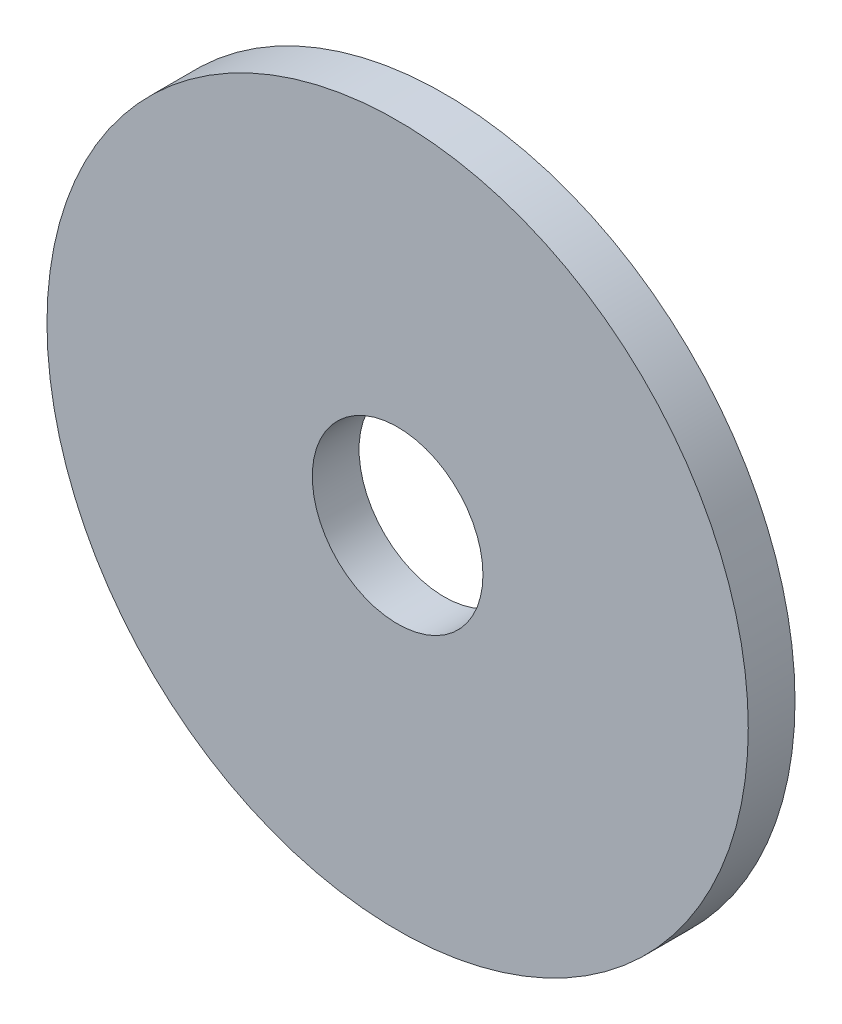
ISO-10303-21;
HEADER;
FILE_DESCRIPTION(('STEP AP214'),'2;1');
FILE_NAME('part.step','',(''),(''),'','','');
FILE_SCHEMA(('AUTOMOTIVE_DESIGN { 1 0 10303 214 1 1 1 1 }'));
ENDSEC;
DATA;
#1=APPLICATION_CONTEXT('core data for automotive mechanical design processes');
#2=APPLICATION_PROTOCOL_DEFINITION('international standard','automotive_design',2000,#1);
#3=PRODUCT_CONTEXT('',#1,'mechanical');
#4=PRODUCT('Part','Part','',(#3));
#5=PRODUCT_RELATED_PRODUCT_CATEGORY('part','',(#4));
#6=PRODUCT_DEFINITION_FORMATION('','',#4);
#7=PRODUCT_DEFINITION_CONTEXT('part definition',#1,'design');
#8=PRODUCT_DEFINITION('design','',#6,#7);
#9=PRODUCT_DEFINITION_SHAPE('','',#8);
#10=(LENGTH_UNIT() NAMED_UNIT(*) SI_UNIT(.MILLI.,.METRE.));
#11=(NAMED_UNIT(*) PLANE_ANGLE_UNIT() SI_UNIT($,.RADIAN.));
#12=(NAMED_UNIT(*) SI_UNIT($,.STERADIAN.) SOLID_ANGLE_UNIT());
#13=UNCERTAINTY_MEASURE_WITH_UNIT(LENGTH_MEASURE(1.E-05),#10,'distance_accuracy_value','');
#14=(GEOMETRIC_REPRESENTATION_CONTEXT(3) GLOBAL_UNCERTAINTY_ASSIGNED_CONTEXT((#13)) GLOBAL_UNIT_ASSIGNED_CONTEXT((#10,
#11,#12)) REPRESENTATION_CONTEXT('',''));
#15=CARTESIAN_POINT('',(0.,0.,0.));
#16=DIRECTION('',(0.,0.,1.));
#17=DIRECTION('',(1.,0.,0.));
#18=AXIS2_PLACEMENT_3D('',#15,#16,#17);
#19=CARTESIAN_POINT('',(0.,0.,1.));
#20=DIRECTION('',(0.,0.,1.));
#21=DIRECTION('',(1.,0.,0.));
#22=AXIS2_PLACEMENT_3D('',#19,#20,#21);
#23=PLANE('',#22);
#24=CARTESIAN_POINT('',(0.,0.,1.));
#25=DIRECTION('',(0.,0.,1.));
#26=DIRECTION('',(1.,0.,0.));
#27=AXIS2_PLACEMENT_3D('',#24,#25,#26);
#28=CIRCLE('',#27,15.);
#29=CARTESIAN_POINT('',(15.,0.,1.));
#30=VERTEX_POINT('',#29);
#31=EDGE_CURVE('E10',#30,#30,#28,.T.);
#32=ORIENTED_EDGE('',*,*,#31,.T.);
#33=EDGE_LOOP('',(#32));
#34=FACE_BOUND('',#33,.T.);
#35=CARTESIAN_POINT('',(0.,0.,1.));
#36=DIRECTION('',(0.,0.,1.));
#37=DIRECTION('',(1.,0.,0.));
#38=AXIS2_PLACEMENT_3D('',#35,#36,#37);
#39=CIRCLE('',#38,3.65);
#40=CARTESIAN_POINT('',(3.65,0.,1.));
#41=VERTEX_POINT('',#40);
#42=EDGE_CURVE('E46',#41,#41,#39,.T.);
#43=ORIENTED_EDGE('',*,*,#42,.F.);
#44=EDGE_LOOP('',(#43));
#45=FACE_BOUND('',#44,.T.);
#46=ADVANCED_FACE('F35',(#34,#45),#23,.T.);
#47=CARTESIAN_POINT('',(0.,0.,-1.));
#48=DIRECTION('',(0.,0.,1.));
#49=DIRECTION('',(1.,0.,0.));
#50=AXIS2_PLACEMENT_3D('',#47,#48,#49);
#51=PLANE('',#50);
#52=CARTESIAN_POINT('',(0.,0.,-1.));
#53=DIRECTION('',(0.,0.,1.));
#54=DIRECTION('',(1.,0.,0.));
#55=AXIS2_PLACEMENT_3D('',#52,#53,#54);
#56=CIRCLE('',#55,15.);
#57=CARTESIAN_POINT('',(15.,0.,-1.));
#58=VERTEX_POINT('',#57);
#59=EDGE_CURVE('E39',#58,#58,#56,.T.);
#60=ORIENTED_EDGE('',*,*,#59,.F.);
#61=EDGE_LOOP('',(#60));
#62=FACE_BOUND('',#61,.T.);
#63=CARTESIAN_POINT('',(0.,0.,-1.));
#64=DIRECTION('',(0.,0.,1.));
#65=DIRECTION('',(1.,0.,0.));
#66=AXIS2_PLACEMENT_3D('',#63,#64,#65);
#67=CIRCLE('',#66,3.65);
#68=CARTESIAN_POINT('',(3.65,0.,-1.));
#69=VERTEX_POINT('',#68);
#70=EDGE_CURVE('E48',#69,#69,#67,.T.);
#71=ORIENTED_EDGE('',*,*,#70,.T.);
#72=EDGE_LOOP('',(#71));
#73=FACE_BOUND('',#72,.T.);
#74=ADVANCED_FACE('F58',(#62,#73),#51,.F.);
#75=CARTESIAN_POINT('',(0.,0.,1.));
#76=DIRECTION('',(0.,0.,-1.));
#77=DIRECTION('',(-1.,0.,0.));
#78=AXIS2_PLACEMENT_3D('',#75,#76,#77);
#79=CYLINDRICAL_SURFACE('',#78,15.);
#80=ORIENTED_EDGE('',*,*,#31,.F.);
#81=EDGE_LOOP('',(#80));
#82=FACE_BOUND('',#81,.T.);
#83=ORIENTED_EDGE('',*,*,#59,.T.);
#84=EDGE_LOOP('',(#83));
#85=FACE_BOUND('',#84,.T.);
#86=ADVANCED_FACE('F37',(#82,#85),#79,.T.);
#87=CARTESIAN_POINT('',(0.,0.,1.));
#88=DIRECTION('',(0.,0.,-1.));
#89=DIRECTION('',(-1.,0.,0.));
#90=AXIS2_PLACEMENT_3D('',#87,#88,#89);
#91=CYLINDRICAL_SURFACE('',#90,3.65);
#92=ORIENTED_EDGE('',*,*,#42,.T.);
#93=EDGE_LOOP('',(#92));
#94=FACE_BOUND('',#93,.T.);
#95=ORIENTED_EDGE('',*,*,#70,.F.);
#96=EDGE_LOOP('',(#95));
#97=FACE_BOUND('',#96,.T.);
#98=ADVANCED_FACE('F54',(#94,#97),#91,.F.);
#99=CLOSED_SHELL('',(#46,#74,#86,#98));
#100=MANIFOLD_SOLID_BREP('B2',#99);
#101=ADVANCED_BREP_SHAPE_REPRESENTATION('',(#18,#100),#14);
#102=SHAPE_DEFINITION_REPRESENTATION(#9,#101);
ENDSEC;
END-ISO-10303-21;
